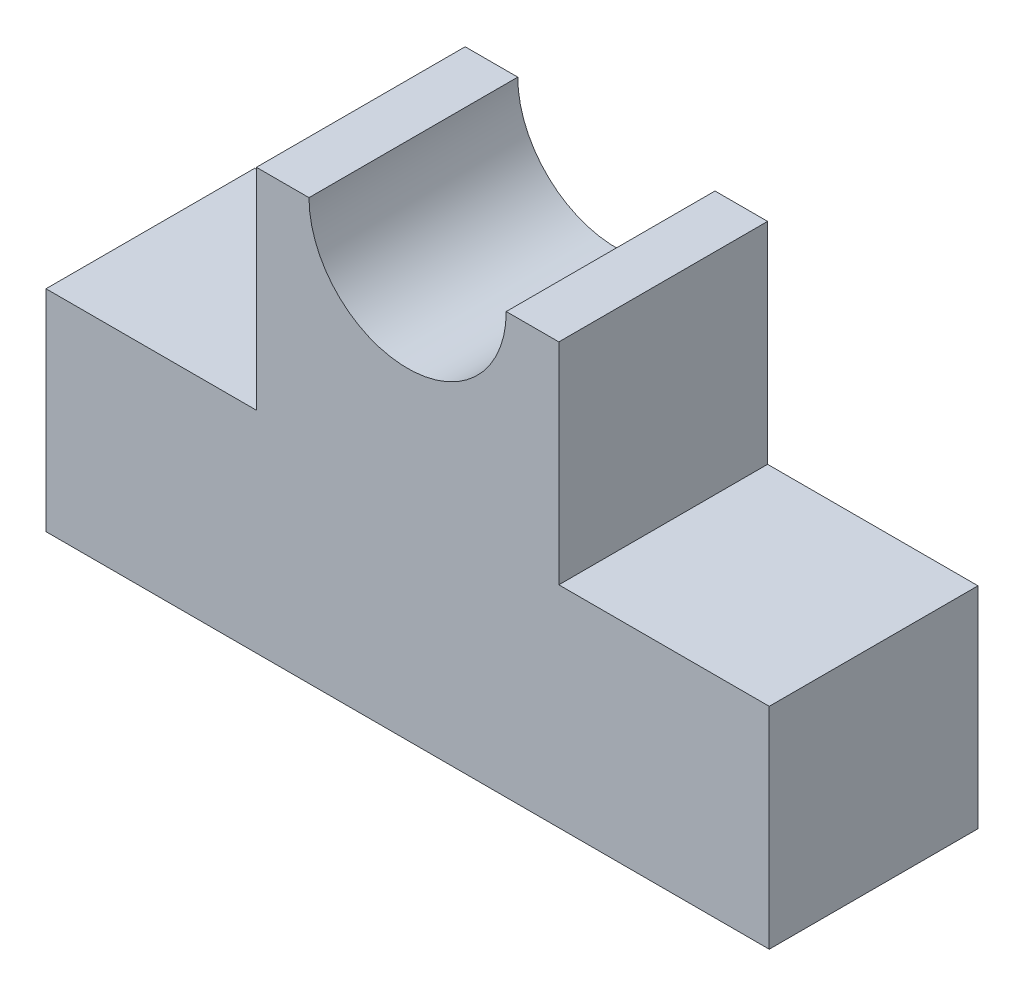
ISO-10303-21;
HEADER;
FILE_DESCRIPTION(('STEP AP214'),'2;1');
FILE_NAME('part.step','',(''),(''),'','','');
FILE_SCHEMA(('AUTOMOTIVE_DESIGN { 1 0 10303 214 1 1 1 1 }'));
ENDSEC;
DATA;
#1=APPLICATION_CONTEXT('core data for automotive mechanical design processes');
#2=APPLICATION_PROTOCOL_DEFINITION('international standard','automotive_design',2000,#1);
#3=PRODUCT_CONTEXT('',#1,'mechanical');
#4=PRODUCT('Part','Part','',(#3));
#5=PRODUCT_RELATED_PRODUCT_CATEGORY('part','',(#4));
#6=PRODUCT_DEFINITION_FORMATION('','',#4);
#7=PRODUCT_DEFINITION_CONTEXT('part definition',#1,'design');
#8=PRODUCT_DEFINITION('design','',#6,#7);
#9=PRODUCT_DEFINITION_SHAPE('','',#8);
#10=(LENGTH_UNIT() NAMED_UNIT(*) SI_UNIT(.MILLI.,.METRE.));
#11=(NAMED_UNIT(*) PLANE_ANGLE_UNIT() SI_UNIT($,.RADIAN.));
#12=(NAMED_UNIT(*) SI_UNIT($,.STERADIAN.) SOLID_ANGLE_UNIT());
#13=UNCERTAINTY_MEASURE_WITH_UNIT(LENGTH_MEASURE(1.E-05),#10,'distance_accuracy_value','');
#14=(GEOMETRIC_REPRESENTATION_CONTEXT(3) GLOBAL_UNCERTAINTY_ASSIGNED_CONTEXT((#13)) GLOBAL_UNIT_ASSIGNED_CONTEXT((#10,
#11,#12)) REPRESENTATION_CONTEXT('',''));
#15=CARTESIAN_POINT('',(0.,0.,0.));
#16=DIRECTION('',(0.,0.,1.));
#17=DIRECTION('',(1.,0.,0.));
#18=AXIS2_PLACEMENT_3D('',#15,#16,#17);
#19=CARTESIAN_POINT('',(0.,3.2,6.35));
#20=DIRECTION('',(0.,-1.,0.));
#21=DIRECTION('',(1.,0.,0.));
#22=AXIS2_PLACEMENT_3D('',#19,#20,#21);
#23=PLANE('',#22);
#24=DIRECTION('',(-1.,0.,0.));
#25=VECTOR('',#24,1.);
#26=CARTESIAN_POINT('',(0.,3.2,0.));
#27=LINE('',#26,#25);
#28=CARTESIAN_POINT('',(11.,3.2,0.));
#29=VERTEX_POINT('',#28);
#30=CARTESIAN_POINT('',(4.6,3.2,0.));
#31=VERTEX_POINT('',#30);
#32=EDGE_CURVE('E145',#29,#31,#27,.T.);
#33=ORIENTED_EDGE('',*,*,#32,.T.);
#34=DIRECTION('',(0.,0.,-1.));
#35=VECTOR('',#34,1.);
#36=CARTESIAN_POINT('',(4.6,3.2,6.35));
#37=LINE('',#36,#35);
#38=CARTESIAN_POINT('',(4.6,3.2,6.35));
#39=VERTEX_POINT('',#38);
#40=EDGE_CURVE('E11',#39,#31,#37,.T.);
#41=ORIENTED_EDGE('',*,*,#40,.F.);
#42=DIRECTION('',(-1.,0.,0.));
#43=VECTOR('',#42,1.);
#44=CARTESIAN_POINT('',(0.,3.2,6.35));
#45=LINE('',#44,#43);
#46=CARTESIAN_POINT('',(11.,3.2,6.35));
#47=VERTEX_POINT('',#46);
#48=EDGE_CURVE('E97',#47,#39,#45,.T.);
#49=ORIENTED_EDGE('',*,*,#48,.F.);
#50=DIRECTION('',(0.,0.,-1.));
#51=VECTOR('',#50,1.);
#52=CARTESIAN_POINT('',(11.,3.2,6.35));
#53=LINE('',#52,#51);
#54=EDGE_CURVE('E54',#47,#29,#53,.T.);
#55=ORIENTED_EDGE('',*,*,#54,.T.);
#56=EDGE_LOOP('',(#33,#41,#49,#55));
#57=FACE_BOUND('',#56,.T.);
#58=ADVANCED_FACE('F37',(#57),#23,.F.);
#59=CARTESIAN_POINT('',(4.6,0.,6.35));
#60=DIRECTION('',(1.,0.,0.));
#61=DIRECTION('',(0.,1.,0.));
#62=AXIS2_PLACEMENT_3D('',#59,#60,#61);
#63=PLANE('',#62);
#64=DIRECTION('',(0.,-1.,0.));
#65=VECTOR('',#64,1.);
#66=CARTESIAN_POINT('',(4.6,0.,0.));
#67=LINE('',#66,#65);
#68=CARTESIAN_POINT('',(4.6,9.6,0.));
#69=VERTEX_POINT('',#68);
#70=EDGE_CURVE('E147',#69,#31,#67,.T.);
#71=ORIENTED_EDGE('',*,*,#70,.F.);
#72=DIRECTION('',(0.,0.,-1.));
#73=VECTOR('',#72,1.);
#74=CARTESIAN_POINT('',(4.6,9.6,6.35));
#75=LINE('',#74,#73);
#76=CARTESIAN_POINT('',(4.6,9.6,6.35));
#77=VERTEX_POINT('',#76);
#78=EDGE_CURVE('E46',#77,#69,#75,.T.);
#79=ORIENTED_EDGE('',*,*,#78,.F.);
#80=DIRECTION('',(0.,-1.,0.));
#81=VECTOR('',#80,1.);
#82=CARTESIAN_POINT('',(4.6,0.,6.35));
#83=LINE('',#82,#81);
#84=EDGE_CURVE('E199',#77,#39,#83,.T.);
#85=ORIENTED_EDGE('',*,*,#84,.T.);
#86=ORIENTED_EDGE('',*,*,#40,.T.);
#87=EDGE_LOOP('',(#71,#79,#85,#86));
#88=FACE_BOUND('',#87,.T.);
#89=ADVANCED_FACE('F39',(#88),#63,.T.);
#90=CARTESIAN_POINT('',(0.,9.6,6.35));
#91=DIRECTION('',(0.,1.,0.));
#92=DIRECTION('',(0.,0.,1.));
#93=AXIS2_PLACEMENT_3D('',#90,#91,#92);
#94=PLANE('',#93);
#95=DIRECTION('',(1.,0.,0.));
#96=VECTOR('',#95,1.);
#97=CARTESIAN_POINT('',(0.,9.6,0.));
#98=LINE('',#97,#96);
#99=CARTESIAN_POINT('',(3.,9.6,0.));
#100=VERTEX_POINT('',#99);
#101=EDGE_CURVE('E151',#100,#69,#98,.T.);
#102=ORIENTED_EDGE('',*,*,#101,.F.);
#103=DIRECTION('',(0.,0.,-1.));
#104=VECTOR('',#103,1.);
#105=CARTESIAN_POINT('',(3.,9.6,6.35));
#106=LINE('',#105,#104);
#107=CARTESIAN_POINT('',(3.,9.6,6.35));
#108=VERTEX_POINT('',#107);
#109=EDGE_CURVE('E176',#108,#100,#106,.T.);
#110=ORIENTED_EDGE('',*,*,#109,.F.);
#111=DIRECTION('',(1.,0.,0.));
#112=VECTOR('',#111,1.);
#113=CARTESIAN_POINT('',(0.,9.6,6.35));
#114=LINE('',#113,#112);
#115=EDGE_CURVE('E183',#108,#77,#114,.T.);
#116=ORIENTED_EDGE('',*,*,#115,.T.);
#117=ORIENTED_EDGE('',*,*,#78,.T.);
#118=EDGE_LOOP('',(#102,#110,#116,#117));
#119=FACE_BOUND('',#118,.T.);
#120=ADVANCED_FACE('F181',(#119),#94,.T.);
#121=CARTESIAN_POINT('',(0.,9.6,6.35));
#122=DIRECTION('',(0.,0.,-1.));
#123=DIRECTION('',(-1.,0.,0.));
#124=AXIS2_PLACEMENT_3D('',#121,#122,#123);
#125=CYLINDRICAL_SURFACE('',#124,3.);
#126=CARTESIAN_POINT('',(0.,9.6,0.));
#127=DIRECTION('',(0.,0.,1.));
#128=DIRECTION('',(1.,0.,0.));
#129=AXIS2_PLACEMENT_3D('',#126,#127,#128);
#130=CIRCLE('',#129,3.);
#131=CARTESIAN_POINT('',(-3.,9.6,0.));
#132=VERTEX_POINT('',#131);
#133=EDGE_CURVE('E154',#132,#100,#130,.T.);
#134=ORIENTED_EDGE('',*,*,#133,.F.);
#135=DIRECTION('',(0.,0.,-1.));
#136=VECTOR('',#135,1.);
#137=CARTESIAN_POINT('',(-3.,9.6,6.35));
#138=LINE('',#137,#136);
#139=CARTESIAN_POINT('',(-3.,9.6,6.35));
#140=VERTEX_POINT('',#139);
#141=EDGE_CURVE('E174',#140,#132,#138,.T.);
#142=ORIENTED_EDGE('',*,*,#141,.F.);
#143=CARTESIAN_POINT('',(0.,9.6,6.35));
#144=DIRECTION('',(0.,0.,1.));
#145=DIRECTION('',(1.,0.,0.));
#146=AXIS2_PLACEMENT_3D('',#143,#144,#145);
#147=CIRCLE('',#146,3.);
#148=EDGE_CURVE('E196',#140,#108,#147,.T.);
#149=ORIENTED_EDGE('',*,*,#148,.T.);
#150=ORIENTED_EDGE('',*,*,#109,.T.);
#151=EDGE_LOOP('',(#134,#142,#149,#150));
#152=FACE_BOUND('',#151,.T.);
#153=ADVANCED_FACE('F193',(#152),#125,.F.);
#154=CARTESIAN_POINT('',(-4.6,9.6,0.));
#155=VERTEX_POINT('',#154);
#156=EDGE_CURVE('E155',#155,#132,#98,.T.);
#157=ORIENTED_EDGE('',*,*,#156,.F.);
#158=DIRECTION('',(0.,0.,-1.));
#159=VECTOR('',#158,1.);
#160=CARTESIAN_POINT('',(-4.6,9.6,6.35));
#161=LINE('',#160,#159);
#162=CARTESIAN_POINT('',(-4.6,9.6,6.35));
#163=VERTEX_POINT('',#162);
#164=EDGE_CURVE('E172',#163,#155,#161,.T.);
#165=ORIENTED_EDGE('',*,*,#164,.F.);
#166=EDGE_CURVE('E201',#163,#140,#114,.T.);
#167=ORIENTED_EDGE('',*,*,#166,.T.);
#168=ORIENTED_EDGE('',*,*,#141,.T.);
#169=EDGE_LOOP('',(#157,#165,#167,#168));
#170=FACE_BOUND('',#169,.T.);
#171=ADVANCED_FACE('F236',(#170),#94,.T.);
#172=CARTESIAN_POINT('',(-4.6,0.,6.35));
#173=DIRECTION('',(1.,0.,0.));
#174=DIRECTION('',(0.,0.,-1.));
#175=AXIS2_PLACEMENT_3D('',#172,#173,#174);
#176=PLANE('',#175);
#177=DIRECTION('',(0.,-1.,0.));
#178=VECTOR('',#177,1.);
#179=CARTESIAN_POINT('',(-4.6,0.,0.));
#180=LINE('',#179,#178);
#181=CARTESIAN_POINT('',(-4.6,3.2,0.));
#182=VERTEX_POINT('',#181);
#183=EDGE_CURVE('E158',#155,#182,#180,.T.);
#184=ORIENTED_EDGE('',*,*,#183,.T.);
#185=DIRECTION('',(0.,0.,-1.));
#186=VECTOR('',#185,1.);
#187=CARTESIAN_POINT('',(-4.6,3.2,6.35));
#188=LINE('',#187,#186);
#189=CARTESIAN_POINT('',(-4.6,3.2,6.35));
#190=VERTEX_POINT('',#189);
#191=EDGE_CURVE('E169',#190,#182,#188,.T.);
#192=ORIENTED_EDGE('',*,*,#191,.F.);
#193=DIRECTION('',(0.,-1.,0.));
#194=VECTOR('',#193,1.);
#195=CARTESIAN_POINT('',(-4.6,0.,6.35));
#196=LINE('',#195,#194);
#197=EDGE_CURVE('E204',#163,#190,#196,.T.);
#198=ORIENTED_EDGE('',*,*,#197,.F.);
#199=ORIENTED_EDGE('',*,*,#164,.T.);
#200=EDGE_LOOP('',(#184,#192,#198,#199));
#201=FACE_BOUND('',#200,.T.);
#202=ADVANCED_FACE('F210',(#201),#176,.F.);
#203=CARTESIAN_POINT('',(-11.,3.2,0.));
#204=VERTEX_POINT('',#203);
#205=EDGE_CURVE('E148',#182,#204,#27,.T.);
#206=ORIENTED_EDGE('',*,*,#205,.T.);
#207=DIRECTION('',(0.,0.,-1.));
#208=VECTOR('',#207,1.);
#209=CARTESIAN_POINT('',(-11.,3.2,6.35));
#210=LINE('',#209,#208);
#211=CARTESIAN_POINT('',(-11.,3.2,6.35));
#212=VERTEX_POINT('',#211);
#213=EDGE_CURVE('E137',#212,#204,#210,.T.);
#214=ORIENTED_EDGE('',*,*,#213,.F.);
#215=EDGE_CURVE('E125',#190,#212,#45,.T.);
#216=ORIENTED_EDGE('',*,*,#215,.F.);
#217=ORIENTED_EDGE('',*,*,#191,.T.);
#218=EDGE_LOOP('',(#206,#214,#216,#217));
#219=FACE_BOUND('',#218,.T.);
#220=ADVANCED_FACE('F213',(#219),#23,.F.);
#221=CARTESIAN_POINT('',(-11.,0.,6.35));
#222=DIRECTION('',(1.,0.,0.));
#223=DIRECTION('',(0.,0.,-1.));
#224=AXIS2_PLACEMENT_3D('',#221,#222,#223);
#225=PLANE('',#224);
#226=DIRECTION('',(0.,-1.,0.));
#227=VECTOR('',#226,1.);
#228=CARTESIAN_POINT('',(-11.,0.,0.));
#229=LINE('',#228,#227);
#230=CARTESIAN_POINT('',(-11.,-3.2,0.));
#231=VERTEX_POINT('',#230);
#232=EDGE_CURVE('E134',#204,#231,#229,.T.);
#233=ORIENTED_EDGE('',*,*,#232,.T.);
#234=DIRECTION('',(0.,0.,-1.));
#235=VECTOR('',#234,1.);
#236=CARTESIAN_POINT('',(-11.,-3.2,6.35));
#237=LINE('',#236,#235);
#238=CARTESIAN_POINT('',(-11.,-3.2,6.35));
#239=VERTEX_POINT('',#238);
#240=EDGE_CURVE('E131',#239,#231,#237,.T.);
#241=ORIENTED_EDGE('',*,*,#240,.F.);
#242=DIRECTION('',(0.,-1.,0.));
#243=VECTOR('',#242,1.);
#244=CARTESIAN_POINT('',(-11.,0.,6.35));
#245=LINE('',#244,#243);
#246=EDGE_CURVE('E119',#212,#239,#245,.T.);
#247=ORIENTED_EDGE('',*,*,#246,.F.);
#248=ORIENTED_EDGE('',*,*,#213,.T.);
#249=EDGE_LOOP('',(#233,#241,#247,#248));
#250=FACE_BOUND('',#249,.T.);
#251=ADVANCED_FACE('F132',(#250),#225,.F.);
#252=CARTESIAN_POINT('',(0.,-3.2,6.35));
#253=DIRECTION('',(0.,-1.,0.));
#254=DIRECTION('',(1.,0.,0.));
#255=AXIS2_PLACEMENT_3D('',#252,#253,#254);
#256=PLANE('',#255);
#257=DIRECTION('',(-1.,0.,0.));
#258=VECTOR('',#257,1.);
#259=CARTESIAN_POINT('',(0.,-3.2,0.));
#260=LINE('',#259,#258);
#261=CARTESIAN_POINT('',(11.,-3.2,0.));
#262=VERTEX_POINT('',#261);
#263=EDGE_CURVE('E161',#262,#231,#260,.T.);
#264=ORIENTED_EDGE('',*,*,#263,.F.);
#265=DIRECTION('',(0.,0.,-1.));
#266=VECTOR('',#265,1.);
#267=CARTESIAN_POINT('',(11.,-3.2,6.35));
#268=LINE('',#267,#266);
#269=CARTESIAN_POINT('',(11.,-3.2,6.35));
#270=VERTEX_POINT('',#269);
#271=EDGE_CURVE('E85',#270,#262,#268,.T.);
#272=ORIENTED_EDGE('',*,*,#271,.F.);
#273=DIRECTION('',(-1.,0.,0.));
#274=VECTOR('',#273,1.);
#275=CARTESIAN_POINT('',(0.,-3.2,6.35));
#276=LINE('',#275,#274);
#277=EDGE_CURVE('E123',#270,#239,#276,.T.);
#278=ORIENTED_EDGE('',*,*,#277,.T.);
#279=ORIENTED_EDGE('',*,*,#240,.T.);
#280=EDGE_LOOP('',(#264,#272,#278,#279));
#281=FACE_BOUND('',#280,.T.);
#282=ADVANCED_FACE('F139',(#281),#256,.T.);
#283=CARTESIAN_POINT('',(11.,0.,6.35));
#284=DIRECTION('',(1.,0.,0.));
#285=DIRECTION('',(0.,0.,-1.));
#286=AXIS2_PLACEMENT_3D('',#283,#284,#285);
#287=PLANE('',#286);
#288=DIRECTION('',(0.,-1.,0.));
#289=VECTOR('',#288,1.);
#290=CARTESIAN_POINT('',(11.,0.,0.));
#291=LINE('',#290,#289);
#292=EDGE_CURVE('E163',#29,#262,#291,.T.);
#293=ORIENTED_EDGE('',*,*,#292,.F.);
#294=ORIENTED_EDGE('',*,*,#54,.F.);
#295=DIRECTION('',(0.,-1.,0.));
#296=VECTOR('',#295,1.);
#297=CARTESIAN_POINT('',(11.,0.,6.35));
#298=LINE('',#297,#296);
#299=EDGE_CURVE('E140',#47,#270,#298,.T.);
#300=ORIENTED_EDGE('',*,*,#299,.T.);
#301=ORIENTED_EDGE('',*,*,#271,.T.);
#302=EDGE_LOOP('',(#293,#294,#300,#301));
#303=FACE_BOUND('',#302,.T.);
#304=ADVANCED_FACE('F214',(#303),#287,.T.);
#305=CARTESIAN_POINT('',(0.,0.,6.35));
#306=DIRECTION('',(0.,0.,1.));
#307=DIRECTION('',(1.,0.,0.));
#308=AXIS2_PLACEMENT_3D('',#305,#306,#307);
#309=PLANE('',#308);
#310=ORIENTED_EDGE('',*,*,#48,.T.);
#311=ORIENTED_EDGE('',*,*,#84,.F.);
#312=ORIENTED_EDGE('',*,*,#115,.F.);
#313=ORIENTED_EDGE('',*,*,#148,.F.);
#314=ORIENTED_EDGE('',*,*,#166,.F.);
#315=ORIENTED_EDGE('',*,*,#197,.T.);
#316=ORIENTED_EDGE('',*,*,#215,.T.);
#317=ORIENTED_EDGE('',*,*,#246,.T.);
#318=ORIENTED_EDGE('',*,*,#277,.F.);
#319=ORIENTED_EDGE('',*,*,#299,.F.);
#320=EDGE_LOOP('',(#310,#311,#312,#313,#314,#315,#316,#317,#318,#319));
#321=FACE_BOUND('',#320,.T.);
#322=ADVANCED_FACE('F121',(#321),#309,.T.);
#323=CARTESIAN_POINT('',(0.,0.,0.));
#324=DIRECTION('',(0.,0.,1.));
#325=DIRECTION('',(1.,0.,0.));
#326=AXIS2_PLACEMENT_3D('',#323,#324,#325);
#327=PLANE('',#326);
#328=ORIENTED_EDGE('',*,*,#32,.F.);
#329=ORIENTED_EDGE('',*,*,#292,.T.);
#330=ORIENTED_EDGE('',*,*,#263,.T.);
#331=ORIENTED_EDGE('',*,*,#232,.F.);
#332=ORIENTED_EDGE('',*,*,#205,.F.);
#333=ORIENTED_EDGE('',*,*,#183,.F.);
#334=ORIENTED_EDGE('',*,*,#156,.T.);
#335=ORIENTED_EDGE('',*,*,#133,.T.);
#336=ORIENTED_EDGE('',*,*,#101,.T.);
#337=ORIENTED_EDGE('',*,*,#70,.T.);
#338=EDGE_LOOP('',(#328,#329,#330,#331,#332,#333,#334,#335,#336,#337));
#339=FACE_BOUND('',#338,.T.);
#340=ADVANCED_FACE('F187',(#339),#327,.F.);
#341=CLOSED_SHELL('',(#58,#89,#120,#153,#171,#202,#220,#251,#282,#304,#322,#340));
#342=MANIFOLD_SOLID_BREP('B2',#341);
#343=ADVANCED_BREP_SHAPE_REPRESENTATION('',(#18,#342),#14);
#344=SHAPE_DEFINITION_REPRESENTATION(#9,#343);
ENDSEC;
END-ISO-10303-21;
